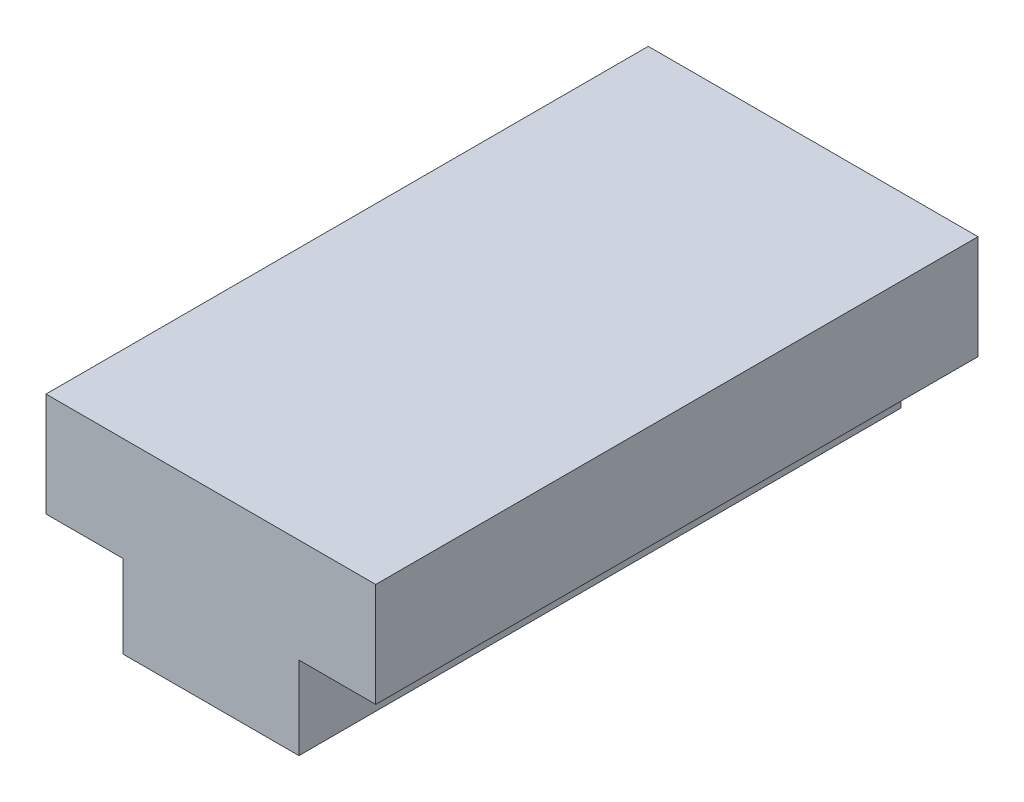
ISO-10303-21;
HEADER;
FILE_DESCRIPTION(('STEP AP214'),'2;1');
FILE_NAME('part.step','',(''),(''),'','','');
FILE_SCHEMA(('AUTOMOTIVE_DESIGN { 1 0 10303 214 1 1 1 1 }'));
ENDSEC;
DATA;
#1=APPLICATION_CONTEXT('core data for automotive mechanical design processes');
#2=APPLICATION_PROTOCOL_DEFINITION('international standard','automotive_design',2000,#1);
#3=PRODUCT_CONTEXT('',#1,'mechanical');
#4=PRODUCT('Part','Part','',(#3));
#5=PRODUCT_RELATED_PRODUCT_CATEGORY('part','',(#4));
#6=PRODUCT_DEFINITION_FORMATION('','',#4);
#7=PRODUCT_DEFINITION_CONTEXT('part definition',#1,'design');
#8=PRODUCT_DEFINITION('design','',#6,#7);
#9=PRODUCT_DEFINITION_SHAPE('','',#8);
#10=(LENGTH_UNIT() NAMED_UNIT(*) SI_UNIT(.MILLI.,.METRE.));
#11=(NAMED_UNIT(*) PLANE_ANGLE_UNIT() SI_UNIT($,.RADIAN.));
#12=(NAMED_UNIT(*) SI_UNIT($,.STERADIAN.) SOLID_ANGLE_UNIT());
#13=UNCERTAINTY_MEASURE_WITH_UNIT(LENGTH_MEASURE(1.E-05),#10,'distance_accuracy_value','');
#14=(GEOMETRIC_REPRESENTATION_CONTEXT(3) GLOBAL_UNCERTAINTY_ASSIGNED_CONTEXT((#13)) GLOBAL_UNIT_ASSIGNED_CONTEXT((#10,
#11,#12)) REPRESENTATION_CONTEXT('',''));
#15=CARTESIAN_POINT('',(0.,0.,0.));
#16=DIRECTION('',(0.,0.,1.));
#17=DIRECTION('',(1.,0.,0.));
#18=AXIS2_PLACEMENT_3D('',#15,#16,#17);
#19=CARTESIAN_POINT('',(5.85,0.,-40.));
#20=DIRECTION('',(-1.,0.,0.));
#21=DIRECTION('',(0.,0.,1.));
#22=AXIS2_PLACEMENT_3D('',#19,#20,#21);
#23=PLANE('',#22);
#24=DIRECTION('',(0.,-1.,0.));
#25=VECTOR('',#24,1.);
#26=CARTESIAN_POINT('',(5.85,0.,0.));
#27=LINE('',#26,#25);
#28=CARTESIAN_POINT('',(5.85,0.,0.));
#29=VERTEX_POINT('',#28);
#30=CARTESIAN_POINT('',(5.85,-5.5,0.));
#31=VERTEX_POINT('',#30);
#32=EDGE_CURVE('E147',#29,#31,#27,.T.);
#33=ORIENTED_EDGE('',*,*,#32,.T.);
#34=DIRECTION('',(0.,0.,1.));
#35=VECTOR('',#34,1.);
#36=CARTESIAN_POINT('',(5.85,-5.5,-40.));
#37=LINE('',#36,#35);
#38=CARTESIAN_POINT('',(5.85,-5.5,-40.));
#39=VERTEX_POINT('',#38);
#40=EDGE_CURVE('E11',#39,#31,#37,.T.);
#41=ORIENTED_EDGE('',*,*,#40,.F.);
#42=DIRECTION('',(0.,-1.,0.));
#43=VECTOR('',#42,1.);
#44=CARTESIAN_POINT('',(5.85,0.,-40.));
#45=LINE('',#44,#43);
#46=CARTESIAN_POINT('',(5.85,0.,-40.));
#47=VERTEX_POINT('',#46);
#48=EDGE_CURVE('E62',#47,#39,#45,.T.);
#49=ORIENTED_EDGE('',*,*,#48,.F.);
#50=DIRECTION('',(0.,0.,1.));
#51=VECTOR('',#50,1.);
#52=CARTESIAN_POINT('',(5.85,0.,-40.));
#53=LINE('',#52,#51);
#54=EDGE_CURVE('E46',#47,#29,#53,.T.);
#55=ORIENTED_EDGE('',*,*,#54,.T.);
#56=EDGE_LOOP('',(#33,#41,#49,#55));
#57=FACE_BOUND('',#56,.T.);
#58=ADVANCED_FACE('F43',(#57),#23,.F.);
#59=CARTESIAN_POINT('',(0.,-5.5,-40.));
#60=DIRECTION('',(0.,-1.,0.));
#61=DIRECTION('',(0.,0.,-1.));
#62=AXIS2_PLACEMENT_3D('',#59,#60,#61);
#63=PLANE('',#62);
#64=DIRECTION('',(1.,0.,0.));
#65=VECTOR('',#64,1.);
#66=CARTESIAN_POINT('',(0.,-5.5,0.));
#67=LINE('',#66,#65);
#68=CARTESIAN_POINT('',(-5.85,-5.5,0.));
#69=VERTEX_POINT('',#68);
#70=EDGE_CURVE('E168',#69,#31,#67,.T.);
#71=ORIENTED_EDGE('',*,*,#70,.F.);
#72=DIRECTION('',(0.,0.,1.));
#73=VECTOR('',#72,1.);
#74=CARTESIAN_POINT('',(-5.85,-5.5,-40.));
#75=LINE('',#74,#73);
#76=CARTESIAN_POINT('',(-5.85,-5.5,-40.));
#77=VERTEX_POINT('',#76);
#78=EDGE_CURVE('E53',#77,#69,#75,.T.);
#79=ORIENTED_EDGE('',*,*,#78,.F.);
#80=DIRECTION('',(1.,0.,0.));
#81=VECTOR('',#80,1.);
#82=CARTESIAN_POINT('',(0.,-5.5,-40.));
#83=LINE('',#82,#81);
#84=EDGE_CURVE('E131',#77,#39,#83,.T.);
#85=ORIENTED_EDGE('',*,*,#84,.T.);
#86=ORIENTED_EDGE('',*,*,#40,.T.);
#87=EDGE_LOOP('',(#71,#79,#85,#86));
#88=FACE_BOUND('',#87,.T.);
#89=ADVANCED_FACE('F193',(#88),#63,.T.);
#90=CARTESIAN_POINT('',(-5.85,0.,-40.));
#91=DIRECTION('',(-1.,0.,0.));
#92=DIRECTION('',(0.,0.,1.));
#93=AXIS2_PLACEMENT_3D('',#90,#91,#92);
#94=PLANE('',#93);
#95=DIRECTION('',(0.,-1.,0.));
#96=VECTOR('',#95,1.);
#97=CARTESIAN_POINT('',(-5.85,0.,0.));
#98=LINE('',#97,#96);
#99=CARTESIAN_POINT('',(-5.85,0.,0.));
#100=VERTEX_POINT('',#99);
#101=EDGE_CURVE('E118',#100,#69,#98,.T.);
#102=ORIENTED_EDGE('',*,*,#101,.F.);
#103=DIRECTION('',(0.,0.,1.));
#104=VECTOR('',#103,1.);
#105=CARTESIAN_POINT('',(-5.85,0.,-40.));
#106=LINE('',#105,#104);
#107=CARTESIAN_POINT('',(-5.85,0.,-40.));
#108=VERTEX_POINT('',#107);
#109=EDGE_CURVE('E114',#108,#100,#106,.T.);
#110=ORIENTED_EDGE('',*,*,#109,.F.);
#111=DIRECTION('',(0.,-1.,0.));
#112=VECTOR('',#111,1.);
#113=CARTESIAN_POINT('',(-5.85,0.,-40.));
#114=LINE('',#113,#112);
#115=EDGE_CURVE('E117',#108,#77,#114,.T.);
#116=ORIENTED_EDGE('',*,*,#115,.T.);
#117=ORIENTED_EDGE('',*,*,#78,.T.);
#118=EDGE_LOOP('',(#102,#110,#116,#117));
#119=FACE_BOUND('',#118,.T.);
#120=ADVANCED_FACE('F116',(#119),#94,.T.);
#121=CARTESIAN_POINT('',(0.,0.,-40.));
#122=DIRECTION('',(0.,-1.,0.));
#123=DIRECTION('',(1.,0.,0.));
#124=AXIS2_PLACEMENT_3D('',#121,#122,#123);
#125=PLANE('',#124);
#126=DIRECTION('',(1.,0.,0.));
#127=VECTOR('',#126,1.);
#128=CARTESIAN_POINT('',(0.,0.,0.));
#129=LINE('',#128,#127);
#130=CARTESIAN_POINT('',(-10.95,0.,0.));
#131=VERTEX_POINT('',#130);
#132=EDGE_CURVE('E164',#131,#100,#129,.T.);
#133=ORIENTED_EDGE('',*,*,#132,.F.);
#134=DIRECTION('',(0.,0.,1.));
#135=VECTOR('',#134,1.);
#136=CARTESIAN_POINT('',(-10.95,0.,-40.));
#137=LINE('',#136,#135);
#138=CARTESIAN_POINT('',(-10.95,0.,-40.));
#139=VERTEX_POINT('',#138);
#140=EDGE_CURVE('E124',#139,#131,#137,.T.);
#141=ORIENTED_EDGE('',*,*,#140,.F.);
#142=DIRECTION('',(1.,0.,0.));
#143=VECTOR('',#142,1.);
#144=CARTESIAN_POINT('',(0.,0.,-40.));
#145=LINE('',#144,#143);
#146=EDGE_CURVE('E129',#139,#108,#145,.T.);
#147=ORIENTED_EDGE('',*,*,#146,.T.);
#148=ORIENTED_EDGE('',*,*,#109,.T.);
#149=EDGE_LOOP('',(#133,#141,#147,#148));
#150=FACE_BOUND('',#149,.T.);
#151=ADVANCED_FACE('F134',(#150),#125,.T.);
#152=CARTESIAN_POINT('',(-10.95,0.,-40.));
#153=DIRECTION('',(-1.,0.,0.));
#154=DIRECTION('',(0.,0.,1.));
#155=AXIS2_PLACEMENT_3D('',#152,#153,#154);
#156=PLANE('',#155);
#157=DIRECTION('',(0.,-1.,0.));
#158=VECTOR('',#157,1.);
#159=CARTESIAN_POINT('',(-10.95,0.,0.));
#160=LINE('',#159,#158);
#161=CARTESIAN_POINT('',(-10.95,6.9,0.));
#162=VERTEX_POINT('',#161);
#163=EDGE_CURVE('E160',#162,#131,#160,.T.);
#164=ORIENTED_EDGE('',*,*,#163,.F.);
#165=DIRECTION('',(0.,0.,1.));
#166=VECTOR('',#165,1.);
#167=CARTESIAN_POINT('',(-10.95,6.9,-40.));
#168=LINE('',#167,#166);
#169=CARTESIAN_POINT('',(-10.95,6.9,-40.));
#170=VERTEX_POINT('',#169);
#171=EDGE_CURVE('E176',#170,#162,#168,.T.);
#172=ORIENTED_EDGE('',*,*,#171,.F.);
#173=DIRECTION('',(0.,-1.,0.));
#174=VECTOR('',#173,1.);
#175=CARTESIAN_POINT('',(-10.95,0.,-40.));
#176=LINE('',#175,#174);
#177=EDGE_CURVE('E136',#170,#139,#176,.T.);
#178=ORIENTED_EDGE('',*,*,#177,.T.);
#179=ORIENTED_EDGE('',*,*,#140,.T.);
#180=EDGE_LOOP('',(#164,#172,#178,#179));
#181=FACE_BOUND('',#180,.T.);
#182=ADVANCED_FACE('F206',(#181),#156,.T.);
#183=CARTESIAN_POINT('',(0.,6.9,-40.));
#184=DIRECTION('',(0.,1.,0.));
#185=DIRECTION('',(-1.,0.,0.));
#186=AXIS2_PLACEMENT_3D('',#183,#184,#185);
#187=PLANE('',#186);
#188=DIRECTION('',(-1.,0.,0.));
#189=VECTOR('',#188,1.);
#190=CARTESIAN_POINT('',(0.,6.9,0.));
#191=LINE('',#190,#189);
#192=CARTESIAN_POINT('',(10.95,6.9,0.));
#193=VERTEX_POINT('',#192);
#194=EDGE_CURVE('E156',#193,#162,#191,.T.);
#195=ORIENTED_EDGE('',*,*,#194,.F.);
#196=DIRECTION('',(0.,0.,1.));
#197=VECTOR('',#196,1.);
#198=CARTESIAN_POINT('',(10.95,6.9,-40.));
#199=LINE('',#198,#197);
#200=CARTESIAN_POINT('',(10.95,6.9,-40.));
#201=VERTEX_POINT('',#200);
#202=EDGE_CURVE('E179',#201,#193,#199,.T.);
#203=ORIENTED_EDGE('',*,*,#202,.F.);
#204=DIRECTION('',(-1.,0.,0.));
#205=VECTOR('',#204,1.);
#206=CARTESIAN_POINT('',(0.,6.9,-40.));
#207=LINE('',#206,#205);
#208=EDGE_CURVE('E141',#201,#170,#207,.T.);
#209=ORIENTED_EDGE('',*,*,#208,.T.);
#210=ORIENTED_EDGE('',*,*,#171,.T.);
#211=EDGE_LOOP('',(#195,#203,#209,#210));
#212=FACE_BOUND('',#211,.T.);
#213=ADVANCED_FACE('F209',(#212),#187,.T.);
#214=CARTESIAN_POINT('',(10.95,0.,-40.));
#215=DIRECTION('',(-1.,0.,0.));
#216=DIRECTION('',(0.,0.,1.));
#217=AXIS2_PLACEMENT_3D('',#214,#215,#216);
#218=PLANE('',#217);
#219=DIRECTION('',(0.,-1.,0.));
#220=VECTOR('',#219,1.);
#221=CARTESIAN_POINT('',(10.95,0.,0.));
#222=LINE('',#221,#220);
#223=CARTESIAN_POINT('',(10.95,0.,0.));
#224=VERTEX_POINT('',#223);
#225=EDGE_CURVE('E153',#193,#224,#222,.T.);
#226=ORIENTED_EDGE('',*,*,#225,.T.);
#227=DIRECTION('',(0.,0.,1.));
#228=VECTOR('',#227,1.);
#229=CARTESIAN_POINT('',(10.95,0.,-40.));
#230=LINE('',#229,#228);
#231=CARTESIAN_POINT('',(10.95,0.,-40.));
#232=VERTEX_POINT('',#231);
#233=EDGE_CURVE('E180',#232,#224,#230,.T.);
#234=ORIENTED_EDGE('',*,*,#233,.F.);
#235=DIRECTION('',(0.,-1.,0.));
#236=VECTOR('',#235,1.);
#237=CARTESIAN_POINT('',(10.95,0.,-40.));
#238=LINE('',#237,#236);
#239=EDGE_CURVE('E297',#201,#232,#238,.T.);
#240=ORIENTED_EDGE('',*,*,#239,.F.);
#241=ORIENTED_EDGE('',*,*,#202,.T.);
#242=EDGE_LOOP('',(#226,#234,#240,#241));
#243=FACE_BOUND('',#242,.T.);
#244=ADVANCED_FACE('F213',(#243),#218,.F.);
#245=CARTESIAN_POINT('',(0.,0.,-40.));
#246=DIRECTION('',(0.,1.,0.));
#247=DIRECTION('',(-1.,0.,0.));
#248=AXIS2_PLACEMENT_3D('',#245,#246,#247);
#249=PLANE('',#248);
#250=DIRECTION('',(-1.,0.,0.));
#251=VECTOR('',#250,1.);
#252=CARTESIAN_POINT('',(0.,0.,0.));
#253=LINE('',#252,#251);
#254=EDGE_CURVE('E150',#224,#29,#253,.T.);
#255=ORIENTED_EDGE('',*,*,#254,.T.);
#256=ORIENTED_EDGE('',*,*,#54,.F.);
#257=DIRECTION('',(-1.,0.,0.));
#258=VECTOR('',#257,1.);
#259=CARTESIAN_POINT('',(0.,0.,-40.));
#260=LINE('',#259,#258);
#261=EDGE_CURVE('E101',#232,#47,#260,.T.);
#262=ORIENTED_EDGE('',*,*,#261,.F.);
#263=ORIENTED_EDGE('',*,*,#233,.T.);
#264=EDGE_LOOP('',(#255,#256,#262,#263));
#265=FACE_BOUND('',#264,.T.);
#266=ADVANCED_FACE('F216',(#265),#249,.F.);
#267=CARTESIAN_POINT('',(0.,0.,-40.));
#268=DIRECTION('',(0.,0.,1.));
#269=DIRECTION('',(1.,0.,0.));
#270=AXIS2_PLACEMENT_3D('',#267,#268,#269);
#271=PLANE('',#270);
#272=ORIENTED_EDGE('',*,*,#48,.T.);
#273=ORIENTED_EDGE('',*,*,#84,.F.);
#274=ORIENTED_EDGE('',*,*,#115,.F.);
#275=ORIENTED_EDGE('',*,*,#146,.F.);
#276=ORIENTED_EDGE('',*,*,#177,.F.);
#277=ORIENTED_EDGE('',*,*,#208,.F.);
#278=ORIENTED_EDGE('',*,*,#239,.T.);
#279=ORIENTED_EDGE('',*,*,#261,.T.);
#280=EDGE_LOOP('',(#272,#273,#274,#275,#276,#277,#278,#279));
#281=FACE_BOUND('',#280,.T.);
#282=ADVANCED_FACE('F127',(#281),#271,.F.);
#283=CARTESIAN_POINT('',(0.,0.,0.));
#284=DIRECTION('',(0.,0.,1.));
#285=DIRECTION('',(1.,0.,0.));
#286=AXIS2_PLACEMENT_3D('',#283,#284,#285);
#287=PLANE('',#286);
#288=ORIENTED_EDGE('',*,*,#32,.F.);
#289=ORIENTED_EDGE('',*,*,#254,.F.);
#290=ORIENTED_EDGE('',*,*,#225,.F.);
#291=ORIENTED_EDGE('',*,*,#194,.T.);
#292=ORIENTED_EDGE('',*,*,#163,.T.);
#293=ORIENTED_EDGE('',*,*,#132,.T.);
#294=ORIENTED_EDGE('',*,*,#101,.T.);
#295=ORIENTED_EDGE('',*,*,#70,.T.);
#296=EDGE_LOOP('',(#288,#289,#290,#291,#292,#293,#294,#295));
#297=FACE_BOUND('',#296,.T.);
#298=ADVANCED_FACE('F191',(#297),#287,.T.);
#299=CLOSED_SHELL('',(#58,#89,#120,#151,#182,#213,#244,#266,#282,#298));
#300=MANIFOLD_SOLID_BREP('B2',#299);
#301=ADVANCED_BREP_SHAPE_REPRESENTATION('',(#18,#300),#14);
#302=SHAPE_DEFINITION_REPRESENTATION(#9,#301);
ENDSEC;
END-ISO-10303-21;
